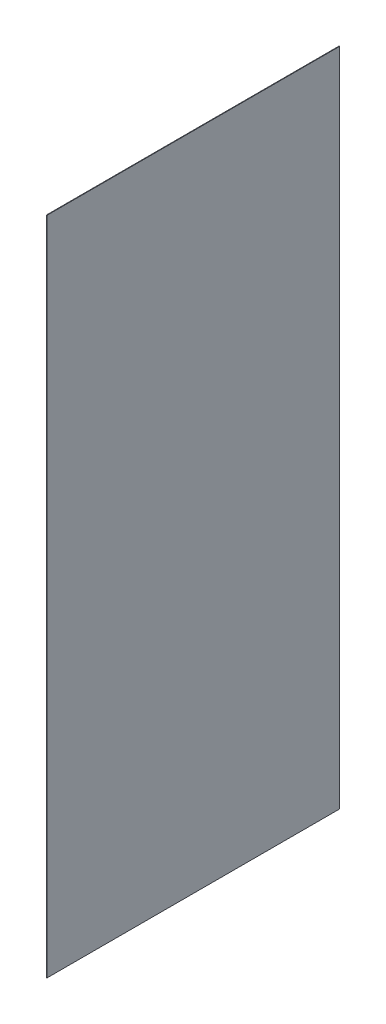
ISO-10303-21;
HEADER;
FILE_DESCRIPTION(('STEP AP214'),'2;1');
FILE_NAME('part.step','',(''),(''),'','','');
FILE_SCHEMA(('AUTOMOTIVE_DESIGN { 1 0 10303 214 1 1 1 1 }'));
ENDSEC;
DATA;
#1=APPLICATION_CONTEXT('core data for automotive mechanical design processes');
#2=APPLICATION_PROTOCOL_DEFINITION('international standard','automotive_design',2000,#1);
#3=PRODUCT_CONTEXT('',#1,'mechanical');
#4=PRODUCT('Part','Part','',(#3));
#5=PRODUCT_RELATED_PRODUCT_CATEGORY('part','',(#4));
#6=PRODUCT_DEFINITION_FORMATION('','',#4);
#7=PRODUCT_DEFINITION_CONTEXT('part definition',#1,'design');
#8=PRODUCT_DEFINITION('design','',#6,#7);
#9=PRODUCT_DEFINITION_SHAPE('','',#8);
#10=(LENGTH_UNIT() NAMED_UNIT(*) SI_UNIT(.MILLI.,.METRE.));
#11=(NAMED_UNIT(*) PLANE_ANGLE_UNIT() SI_UNIT($,.RADIAN.));
#12=(NAMED_UNIT(*) SI_UNIT($,.STERADIAN.) SOLID_ANGLE_UNIT());
#13=UNCERTAINTY_MEASURE_WITH_UNIT(LENGTH_MEASURE(1.E-05),#10,'distance_accuracy_value','');
#14=(GEOMETRIC_REPRESENTATION_CONTEXT(3) GLOBAL_UNCERTAINTY_ASSIGNED_CONTEXT((#13)) GLOBAL_UNIT_ASSIGNED_CONTEXT((#10,
#11,#12)) REPRESENTATION_CONTEXT('',''));
#15=CARTESIAN_POINT('',(0.,0.,0.));
#16=DIRECTION('',(0.,0.,1.));
#17=DIRECTION('',(1.,0.,0.));
#18=AXIS2_PLACEMENT_3D('',#15,#16,#17);
#19=CARTESIAN_POINT('',(1398.5,120.,-820.));
#20=DIRECTION('',(-1.,0.,0.));
#21=DIRECTION('',(0.,0.,1.));
#22=AXIS2_PLACEMENT_3D('',#19,#20,#21);
#23=PLANE('',#22);
#24=DIRECTION('',(0.,-1.,0.));
#25=VECTOR('',#24,1.);
#26=CARTESIAN_POINT('',(1398.5,120.,0.));
#27=LINE('',#26,#25);
#28=CARTESIAN_POINT('',(1398.5,1970.,0.));
#29=VERTEX_POINT('',#28);
#30=CARTESIAN_POINT('',(1398.5,120.,0.));
#31=VERTEX_POINT('',#30);
#32=EDGE_CURVE('E103',#29,#31,#27,.T.);
#33=ORIENTED_EDGE('',*,*,#32,.F.);
#34=DIRECTION('',(0.,0.,1.));
#35=VECTOR('',#34,1.);
#36=CARTESIAN_POINT('',(1398.5,1970.,-820.));
#37=LINE('',#36,#35);
#38=CARTESIAN_POINT('',(1398.5,1970.,-820.));
#39=VERTEX_POINT('',#38);
#40=EDGE_CURVE('E11',#39,#29,#37,.T.);
#41=ORIENTED_EDGE('',*,*,#40,.F.);
#42=DIRECTION('',(0.,-1.,0.));
#43=VECTOR('',#42,1.);
#44=CARTESIAN_POINT('',(1398.5,120.,-820.));
#45=LINE('',#44,#43);
#46=CARTESIAN_POINT('',(1398.5,120.,-820.));
#47=VERTEX_POINT('',#46);
#48=EDGE_CURVE('E97',#39,#47,#45,.T.);
#49=ORIENTED_EDGE('',*,*,#48,.T.);
#50=DIRECTION('',(0.,0.,1.));
#51=VECTOR('',#50,1.);
#52=CARTESIAN_POINT('',(1398.5,120.,-820.));
#53=LINE('',#52,#51);
#54=EDGE_CURVE('E42',#47,#31,#53,.T.);
#55=ORIENTED_EDGE('',*,*,#54,.T.);
#56=EDGE_LOOP('',(#33,#41,#49,#55));
#57=FACE_BOUND('',#56,.T.);
#58=ADVANCED_FACE('F39',(#57),#23,.T.);
#59=CARTESIAN_POINT('',(1398.5,1970.,-820.));
#60=DIRECTION('',(0.,1.,0.));
#61=DIRECTION('',(0.,0.,1.));
#62=AXIS2_PLACEMENT_3D('',#59,#60,#61);
#63=PLANE('',#62);
#64=DIRECTION('',(-1.,0.,0.));
#65=VECTOR('',#64,1.);
#66=CARTESIAN_POINT('',(1398.5,1970.,0.));
#67=LINE('',#66,#65);
#68=CARTESIAN_POINT('',(1400.,1970.,0.));
#69=VERTEX_POINT('',#68);
#70=EDGE_CURVE('E99',#69,#29,#67,.T.);
#71=ORIENTED_EDGE('',*,*,#70,.F.);
#72=DIRECTION('',(0.,0.,1.));
#73=VECTOR('',#72,1.);
#74=CARTESIAN_POINT('',(1400.,1970.,-820.));
#75=LINE('',#74,#73);
#76=CARTESIAN_POINT('',(1400.,1970.,-820.));
#77=VERTEX_POINT('',#76);
#78=EDGE_CURVE('E48',#77,#69,#75,.T.);
#79=ORIENTED_EDGE('',*,*,#78,.F.);
#80=DIRECTION('',(-1.,0.,0.));
#81=VECTOR('',#80,1.);
#82=CARTESIAN_POINT('',(1398.5,1970.,-820.));
#83=LINE('',#82,#81);
#84=EDGE_CURVE('E94',#77,#39,#83,.T.);
#85=ORIENTED_EDGE('',*,*,#84,.T.);
#86=ORIENTED_EDGE('',*,*,#40,.T.);
#87=EDGE_LOOP('',(#71,#79,#85,#86));
#88=FACE_BOUND('',#87,.T.);
#89=ADVANCED_FACE('F113',(#88),#63,.T.);
#90=CARTESIAN_POINT('',(1400.,120.,-820.));
#91=DIRECTION('',(1.,0.,0.));
#92=DIRECTION('',(0.,0.,-1.));
#93=AXIS2_PLACEMENT_3D('',#90,#91,#92);
#94=PLANE('',#93);
#95=DIRECTION('',(0.,1.,0.));
#96=VECTOR('',#95,1.);
#97=CARTESIAN_POINT('',(1400.,120.,0.));
#98=LINE('',#97,#96);
#99=CARTESIAN_POINT('',(1400.,120.,0.));
#100=VERTEX_POINT('',#99);
#101=EDGE_CURVE('E89',#100,#69,#98,.T.);
#102=ORIENTED_EDGE('',*,*,#101,.F.);
#103=DIRECTION('',(0.,0.,1.));
#104=VECTOR('',#103,1.);
#105=CARTESIAN_POINT('',(1400.,120.,-820.));
#106=LINE('',#105,#104);
#107=CARTESIAN_POINT('',(1400.,120.,-820.));
#108=VERTEX_POINT('',#107);
#109=EDGE_CURVE('E84',#108,#100,#106,.T.);
#110=ORIENTED_EDGE('',*,*,#109,.F.);
#111=DIRECTION('',(0.,1.,0.));
#112=VECTOR('',#111,1.);
#113=CARTESIAN_POINT('',(1400.,120.,-820.));
#114=LINE('',#113,#112);
#115=EDGE_CURVE('E87',#108,#77,#114,.T.);
#116=ORIENTED_EDGE('',*,*,#115,.T.);
#117=ORIENTED_EDGE('',*,*,#78,.T.);
#118=EDGE_LOOP('',(#102,#110,#116,#117));
#119=FACE_BOUND('',#118,.T.);
#120=ADVANCED_FACE('F86',(#119),#94,.T.);
#121=CARTESIAN_POINT('',(1398.5,120.,-820.));
#122=DIRECTION('',(0.,-1.,0.));
#123=DIRECTION('',(0.,0.,-1.));
#124=AXIS2_PLACEMENT_3D('',#121,#122,#123);
#125=PLANE('',#124);
#126=DIRECTION('',(1.,0.,0.));
#127=VECTOR('',#126,1.);
#128=CARTESIAN_POINT('',(1398.5,120.,0.));
#129=LINE('',#128,#127);
#130=EDGE_CURVE('E106',#31,#100,#129,.T.);
#131=ORIENTED_EDGE('',*,*,#130,.F.);
#132=ORIENTED_EDGE('',*,*,#54,.F.);
#133=DIRECTION('',(1.,0.,0.));
#134=VECTOR('',#133,1.);
#135=CARTESIAN_POINT('',(1398.5,120.,-820.));
#136=LINE('',#135,#134);
#137=EDGE_CURVE('E93',#47,#108,#136,.T.);
#138=ORIENTED_EDGE('',*,*,#137,.T.);
#139=ORIENTED_EDGE('',*,*,#109,.T.);
#140=EDGE_LOOP('',(#131,#132,#138,#139));
#141=FACE_BOUND('',#140,.T.);
#142=ADVANCED_FACE('F96',(#141),#125,.T.);
#143=CARTESIAN_POINT('',(0.,0.,-820.));
#144=DIRECTION('',(0.,0.,-1.));
#145=DIRECTION('',(-1.,0.,0.));
#146=AXIS2_PLACEMENT_3D('',#143,#144,#145);
#147=PLANE('',#146);
#148=ORIENTED_EDGE('',*,*,#48,.F.);
#149=ORIENTED_EDGE('',*,*,#84,.F.);
#150=ORIENTED_EDGE('',*,*,#115,.F.);
#151=ORIENTED_EDGE('',*,*,#137,.F.);
#152=EDGE_LOOP('',(#148,#149,#150,#151));
#153=FACE_BOUND('',#152,.T.);
#154=ADVANCED_FACE('F92',(#153),#147,.T.);
#155=CARTESIAN_POINT('',(0.,0.,0.));
#156=DIRECTION('',(0.,0.,-1.));
#157=DIRECTION('',(-1.,0.,0.));
#158=AXIS2_PLACEMENT_3D('',#155,#156,#157);
#159=PLANE('',#158);
#160=ORIENTED_EDGE('',*,*,#32,.T.);
#161=ORIENTED_EDGE('',*,*,#130,.T.);
#162=ORIENTED_EDGE('',*,*,#101,.T.);
#163=ORIENTED_EDGE('',*,*,#70,.T.);
#164=EDGE_LOOP('',(#160,#161,#162,#163));
#165=FACE_BOUND('',#164,.T.);
#166=ADVANCED_FACE('F112',(#165),#159,.F.);
#167=CLOSED_SHELL('',(#58,#89,#120,#142,#154,#166));
#168=MANIFOLD_SOLID_BREP('B2',#167);
#169=ADVANCED_BREP_SHAPE_REPRESENTATION('',(#18,#168),#14);
#170=SHAPE_DEFINITION_REPRESENTATION(#9,#169);
ENDSEC;
END-ISO-10303-21;
